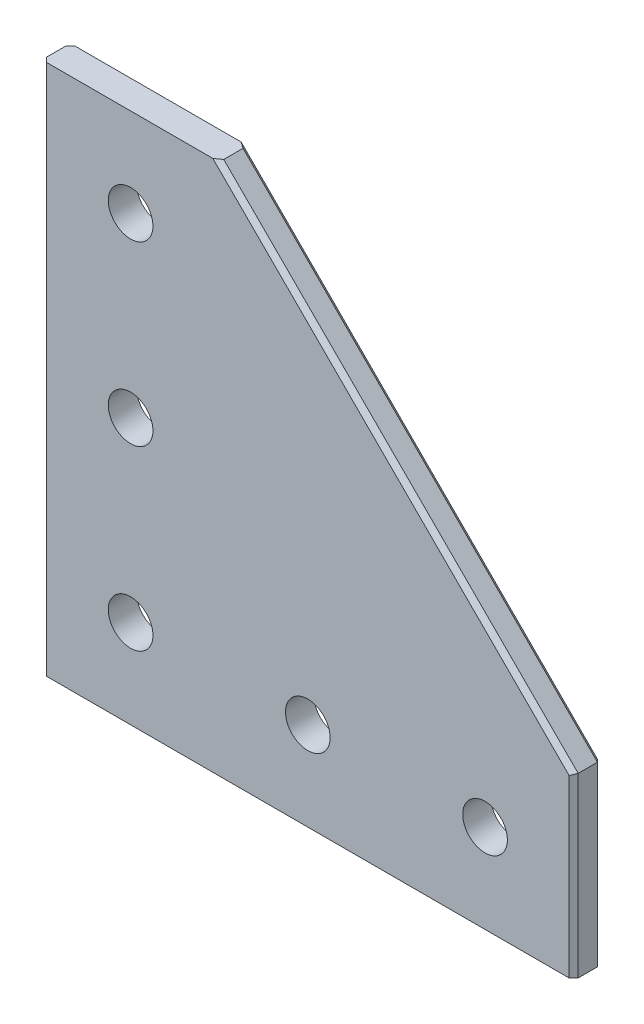
ISO-10303-21;
HEADER;
FILE_DESCRIPTION(('STEP AP214'),'2;1');
FILE_NAME('part.step','',(''),(''),'','','');
FILE_SCHEMA(('AUTOMOTIVE_DESIGN { 1 0 10303 214 1 1 1 1 }'));
ENDSEC;
DATA;
#1=APPLICATION_CONTEXT('core data for automotive mechanical design processes');
#2=APPLICATION_PROTOCOL_DEFINITION('international standard','automotive_design',2000,#1);
#3=PRODUCT_CONTEXT('',#1,'mechanical');
#4=PRODUCT('Part','Part','',(#3));
#5=PRODUCT_RELATED_PRODUCT_CATEGORY('part','',(#4));
#6=PRODUCT_DEFINITION_FORMATION('','',#4);
#7=PRODUCT_DEFINITION_CONTEXT('part definition',#1,'design');
#8=PRODUCT_DEFINITION('design','',#6,#7);
#9=PRODUCT_DEFINITION_SHAPE('','',#8);
#10=(LENGTH_UNIT() NAMED_UNIT(*) SI_UNIT(.MILLI.,.METRE.));
#11=(NAMED_UNIT(*) PLANE_ANGLE_UNIT() SI_UNIT($,.RADIAN.));
#12=(NAMED_UNIT(*) SI_UNIT($,.STERADIAN.) SOLID_ANGLE_UNIT());
#13=UNCERTAINTY_MEASURE_WITH_UNIT(LENGTH_MEASURE(1.E-05),#10,'distance_accuracy_value','');
#14=(GEOMETRIC_REPRESENTATION_CONTEXT(3) GLOBAL_UNCERTAINTY_ASSIGNED_CONTEXT((#13)) GLOBAL_UNIT_ASSIGNED_CONTEXT((#10,
#11,#12)) REPRESENTATION_CONTEXT('',''));
#15=CARTESIAN_POINT('',(0.,0.,0.));
#16=DIRECTION('',(0.,0.,1.));
#17=DIRECTION('',(1.,0.,0.));
#18=AXIS2_PLACEMENT_3D('',#15,#16,#17);
#19=CARTESIAN_POINT('',(51.0543413516609,33.397892325315,4.));
#20=DIRECTION('',(0.,0.,-1.));
#21=DIRECTION('',(-1.,0.,0.));
#22=AXIS2_PLACEMENT_3D('',#19,#20,#21);
#23=PLANE('',#22);
#24=CARTESIAN_POINT('',(13.5543413516609,-29.102107674685,4.));
#25=DIRECTION('',(0.,0.,1.));
#26=DIRECTION('',(1.,0.,0.));
#27=AXIS2_PLACEMENT_3D('',#24,#25,#26);
#28=CIRCLE('',#27,3.15);
#29=CARTESIAN_POINT('',(16.7043413516609,-29.102107674685,4.));
#30=VERTEX_POINT('',#29);
#31=EDGE_CURVE('E189',#30,#30,#28,.T.);
#32=ORIENTED_EDGE('',*,*,#31,.F.);
#33=EDGE_LOOP('',(#32));
#34=FACE_BOUND('',#33,.T.);
#35=CARTESIAN_POINT('',(-11.4456586483391,-4.102107674685,4.));
#36=DIRECTION('',(0.,0.,1.));
#37=DIRECTION('',(1.,0.,0.));
#38=AXIS2_PLACEMENT_3D('',#35,#36,#37);
#39=CIRCLE('',#38,3.15);
#40=CARTESIAN_POINT('',(-8.29565864833906,-4.102107674685,4.));
#41=VERTEX_POINT('',#40);
#42=EDGE_CURVE('E201',#41,#41,#39,.T.);
#43=ORIENTED_EDGE('',*,*,#42,.F.);
#44=EDGE_LOOP('',(#43));
#45=FACE_BOUND('',#44,.T.);
#46=DIRECTION('',(0.,1.,0.));
#47=VECTOR('',#46,1.);
#48=CARTESIAN_POINT('',(50.414341351661,33.397892325315,4.));
#49=LINE('',#48,#47);
#50=CARTESIAN_POINT('',(50.4143413516609,-41.602107674685,4.00000000000001));
#51=VERTEX_POINT('',#50);
#52=CARTESIAN_POINT('',(50.414341351661,-16.8672043546038,4.));
#53=VERTEX_POINT('',#52);
#54=EDGE_CURVE('E50',#51,#53,#49,.T.);
#55=ORIENTED_EDGE('',*,*,#54,.T.);
#56=DIRECTION('',(-0.707106781186548,0.707106781186547,0.));
#57=VECTOR('',#56,1.);
#58=CARTESIAN_POINT('',(25.6017930117016,7.9453439853556,4.));
#59=LINE('',#58,#57);
#60=CARTESIAN_POINT('',(0.149244671742174,33.397892325315,4.));
#61=VERTEX_POINT('',#60);
#62=EDGE_CURVE('E172',#53,#61,#59,.T.);
#63=ORIENTED_EDGE('',*,*,#62,.T.);
#64=DIRECTION('',(-1.,0.,0.));
#65=VECTOR('',#64,1.);
#66=CARTESIAN_POINT('',(1.05434135166094,33.397892325315,4.));
#67=LINE('',#66,#65);
#68=CARTESIAN_POINT('',(-23.305658648339,33.397892325315,4.));
#69=VERTEX_POINT('',#68);
#70=EDGE_CURVE('E119',#61,#69,#67,.T.);
#71=ORIENTED_EDGE('',*,*,#70,.T.);
#72=DIRECTION('',(0.,-1.,0.));
#73=VECTOR('',#72,1.);
#74=CARTESIAN_POINT('',(-23.3056586483391,33.397892325315,4.));
#75=LINE('',#74,#73);
#76=CARTESIAN_POINT('',(-23.3056586483391,-41.602107674685,4.));
#77=VERTEX_POINT('',#76);
#78=EDGE_CURVE('E168',#69,#77,#75,.T.);
#79=ORIENTED_EDGE('',*,*,#78,.T.);
#80=DIRECTION('',(1.,0.,0.));
#81=VECTOR('',#80,1.);
#82=CARTESIAN_POINT('',(-23.9456586483391,-41.602107674685,4.));
#83=LINE('',#82,#81);
#84=EDGE_CURVE('E135',#77,#51,#83,.T.);
#85=ORIENTED_EDGE('',*,*,#84,.T.);
#86=EDGE_LOOP('',(#55,#63,#71,#79,#85));
#87=FACE_BOUND('',#86,.T.);
#88=CARTESIAN_POINT('',(-11.4456586483391,-29.102107674685,4.));
#89=DIRECTION('',(0.,0.,1.));
#90=DIRECTION('',(1.,0.,0.));
#91=AXIS2_PLACEMENT_3D('',#88,#89,#90);
#92=CIRCLE('',#91,3.15);
#93=CARTESIAN_POINT('',(-8.29565864833906,-29.102107674685,4.));
#94=VERTEX_POINT('',#93);
#95=EDGE_CURVE('E207',#94,#94,#92,.T.);
#96=ORIENTED_EDGE('',*,*,#95,.F.);
#97=EDGE_LOOP('',(#96));
#98=FACE_BOUND('',#97,.T.);
#99=CARTESIAN_POINT('',(-11.4456586483391,20.897892325315,4.));
#100=DIRECTION('',(0.,0.,1.));
#101=DIRECTION('',(1.,0.,0.));
#102=AXIS2_PLACEMENT_3D('',#99,#100,#101);
#103=CIRCLE('',#102,3.15);
#104=CARTESIAN_POINT('',(-8.29565864833906,20.897892325315,4.));
#105=VERTEX_POINT('',#104);
#106=EDGE_CURVE('E195',#105,#105,#103,.T.);
#107=ORIENTED_EDGE('',*,*,#106,.F.);
#108=EDGE_LOOP('',(#107));
#109=FACE_BOUND('',#108,.T.);
#110=CARTESIAN_POINT('',(38.554341351661,-29.102107674685,4.));
#111=DIRECTION('',(0.,0.,1.));
#112=DIRECTION('',(1.,0.,0.));
#113=AXIS2_PLACEMENT_3D('',#110,#111,#112);
#114=CIRCLE('',#113,3.15);
#115=CARTESIAN_POINT('',(41.704341351661,-29.102107674685,4.));
#116=VERTEX_POINT('',#115);
#117=EDGE_CURVE('E181',#116,#116,#114,.T.);
#118=ORIENTED_EDGE('',*,*,#117,.F.);
#119=EDGE_LOOP('',(#118));
#120=FACE_BOUND('',#119,.T.);
#121=ADVANCED_FACE('F33',(#34,#45,#87,#98,#109,#120),#23,.F.);
#122=CARTESIAN_POINT('',(51.0543413516609,33.397892325315,0.));
#123=DIRECTION('',(0.,0.,-1.));
#124=DIRECTION('',(-1.,0.,0.));
#125=AXIS2_PLACEMENT_3D('',#122,#123,#124);
#126=PLANE('',#125);
#127=CARTESIAN_POINT('',(13.5543413516609,-29.102107674685,0.));
#128=DIRECTION('',(0.,0.,1.));
#129=DIRECTION('',(1.,0.,0.));
#130=AXIS2_PLACEMENT_3D('',#127,#128,#129);
#131=CIRCLE('',#130,3.15);
#132=CARTESIAN_POINT('',(16.7043413516609,-29.102107674685,0.));
#133=VERTEX_POINT('',#132);
#134=EDGE_CURVE('E186',#133,#133,#131,.T.);
#135=ORIENTED_EDGE('',*,*,#134,.T.);
#136=EDGE_LOOP('',(#135));
#137=FACE_BOUND('',#136,.T.);
#138=CARTESIAN_POINT('',(-11.4456586483391,-4.102107674685,0.));
#139=DIRECTION('',(0.,0.,1.));
#140=DIRECTION('',(1.,0.,0.));
#141=AXIS2_PLACEMENT_3D('',#138,#139,#140);
#142=CIRCLE('',#141,3.15);
#143=CARTESIAN_POINT('',(-8.29565864833906,-4.102107674685,0.));
#144=VERTEX_POINT('',#143);
#145=EDGE_CURVE('E198',#144,#144,#142,.T.);
#146=ORIENTED_EDGE('',*,*,#145,.T.);
#147=EDGE_LOOP('',(#146));
#148=FACE_BOUND('',#147,.T.);
#149=DIRECTION('',(-1.,0.,0.));
#150=VECTOR('',#149,1.);
#151=CARTESIAN_POINT('',(1.05434135166094,33.397892325315,0.));
#152=LINE('',#151,#150);
#153=CARTESIAN_POINT('',(0.149244671742153,33.397892325315,0.));
#154=VERTEX_POINT('',#153);
#155=CARTESIAN_POINT('',(-23.305658648339,33.397892325315,0.));
#156=VERTEX_POINT('',#155);
#157=EDGE_CURVE('E210',#154,#156,#152,.T.);
#158=ORIENTED_EDGE('',*,*,#157,.F.);
#159=DIRECTION('',(0.707106781186548,-0.707106781186547,0.));
#160=VECTOR('',#159,1.);
#161=CARTESIAN_POINT('',(50.6017930117015,-17.0546560146444,0.));
#162=LINE('',#161,#160);
#163=CARTESIAN_POINT('',(50.4143413516609,-16.8672043546038,0.));
#164=VERTEX_POINT('',#163);
#165=EDGE_CURVE('E155',#154,#164,#162,.T.);
#166=ORIENTED_EDGE('',*,*,#165,.T.);
#167=DIRECTION('',(0.,-1.,0.));
#168=VECTOR('',#167,1.);
#169=CARTESIAN_POINT('',(50.4143413516609,-41.602107674685,0.));
#170=LINE('',#169,#168);
#171=CARTESIAN_POINT('',(50.4143413516609,-41.602107674685,0.));
#172=VERTEX_POINT('',#171);
#173=EDGE_CURVE('E153',#164,#172,#170,.T.);
#174=ORIENTED_EDGE('',*,*,#173,.T.);
#175=DIRECTION('',(1.,0.,0.));
#176=VECTOR('',#175,1.);
#177=CARTESIAN_POINT('',(-23.9456586483391,-41.602107674685,0.));
#178=LINE('',#177,#176);
#179=CARTESIAN_POINT('',(-23.3056586483391,-41.602107674685,0.));
#180=VERTEX_POINT('',#179);
#181=EDGE_CURVE('E214',#180,#172,#178,.T.);
#182=ORIENTED_EDGE('',*,*,#181,.F.);
#183=DIRECTION('',(0.,1.,0.));
#184=VECTOR('',#183,1.);
#185=CARTESIAN_POINT('',(-23.3056586483391,33.397892325315,0.));
#186=LINE('',#185,#184);
#187=EDGE_CURVE('E151',#180,#156,#186,.T.);
#188=ORIENTED_EDGE('',*,*,#187,.T.);
#189=EDGE_LOOP('',(#158,#166,#174,#182,#188));
#190=FACE_BOUND('',#189,.T.);
#191=CARTESIAN_POINT('',(-11.4456586483391,-29.102107674685,0.));
#192=DIRECTION('',(0.,0.,1.));
#193=DIRECTION('',(1.,0.,0.));
#194=AXIS2_PLACEMENT_3D('',#191,#192,#193);
#195=CIRCLE('',#194,3.15);
#196=CARTESIAN_POINT('',(-8.29565864833906,-29.102107674685,0.));
#197=VERTEX_POINT('',#196);
#198=EDGE_CURVE('E204',#197,#197,#195,.T.);
#199=ORIENTED_EDGE('',*,*,#198,.T.);
#200=EDGE_LOOP('',(#199));
#201=FACE_BOUND('',#200,.T.);
#202=CARTESIAN_POINT('',(-11.4456586483391,20.897892325315,0.));
#203=DIRECTION('',(0.,0.,1.));
#204=DIRECTION('',(1.,0.,0.));
#205=AXIS2_PLACEMENT_3D('',#202,#203,#204);
#206=CIRCLE('',#205,3.15);
#207=CARTESIAN_POINT('',(-8.29565864833906,20.897892325315,0.));
#208=VERTEX_POINT('',#207);
#209=EDGE_CURVE('E192',#208,#208,#206,.T.);
#210=ORIENTED_EDGE('',*,*,#209,.T.);
#211=EDGE_LOOP('',(#210));
#212=FACE_BOUND('',#211,.T.);
#213=CARTESIAN_POINT('',(38.554341351661,-29.102107674685,0.));
#214=DIRECTION('',(0.,0.,1.));
#215=DIRECTION('',(1.,0.,0.));
#216=AXIS2_PLACEMENT_3D('',#213,#214,#215);
#217=CIRCLE('',#216,3.15);
#218=CARTESIAN_POINT('',(41.704341351661,-29.102107674685,0.));
#219=VERTEX_POINT('',#218);
#220=EDGE_CURVE('E176',#219,#219,#217,.T.);
#221=ORIENTED_EDGE('',*,*,#220,.T.);
#222=EDGE_LOOP('',(#221));
#223=FACE_BOUND('',#222,.T.);
#224=ADVANCED_FACE('F253',(#137,#148,#190,#201,#212,#223),#126,.T.);
#225=CARTESIAN_POINT('',(1.05434135166094,33.397892325315,4.));
#226=DIRECTION('',(0.,-1.,0.));
#227=DIRECTION('',(1.,0.,0.));
#228=AXIS2_PLACEMENT_3D('',#225,#226,#227);
#229=PLANE('',#228);
#230=DIRECTION('',(0.,0.,-1.));
#231=VECTOR('',#230,1.);
#232=CARTESIAN_POINT('',(1.05434135166094,33.397892325315,4.));
#233=LINE('',#232,#231);
#234=CARTESIAN_POINT('',(1.05434135166094,33.397892325315,3.36000000000001));
#235=VERTEX_POINT('',#234);
#236=CARTESIAN_POINT('',(1.05434135166094,33.397892325315,0.640000000000002));
#237=VERTEX_POINT('',#236);
#238=EDGE_CURVE('E117',#235,#237,#233,.T.);
#239=ORIENTED_EDGE('',*,*,#238,.T.);
#240=DIRECTION('',(-0.816496580927726,0.,-0.577350269189626));
#241=VECTOR('',#240,1.);
#242=CARTESIAN_POINT('',(34.3876746849943,33.397892325315,24.2102260395516));
#243=LINE('',#242,#241);
#244=EDGE_CURVE('E123',#237,#154,#243,.T.);
#245=ORIENTED_EDGE('',*,*,#244,.T.);
#246=ORIENTED_EDGE('',*,*,#157,.T.);
#247=DIRECTION('',(-0.707106781186548,0.,0.707106781186548));
#248=VECTOR('',#247,1.);
#249=CARTESIAN_POINT('',(-23.9456586483391,33.397892325315,0.640000000000002));
#250=LINE('',#249,#248);
#251=CARTESIAN_POINT('',(-23.9456586483391,33.397892325315,0.640000000000003));
#252=VERTEX_POINT('',#251);
#253=EDGE_CURVE('E124',#156,#252,#250,.T.);
#254=ORIENTED_EDGE('',*,*,#253,.T.);
#255=DIRECTION('',(0.,0.,-1.));
#256=VECTOR('',#255,1.);
#257=CARTESIAN_POINT('',(-23.9456586483391,33.397892325315,4.));
#258=LINE('',#257,#256);
#259=CARTESIAN_POINT('',(-23.9456586483391,33.397892325315,3.36));
#260=VERTEX_POINT('',#259);
#261=EDGE_CURVE('E139',#260,#252,#258,.T.);
#262=ORIENTED_EDGE('',*,*,#261,.F.);
#263=DIRECTION('',(-0.707106781186548,0.,-0.707106781186548));
#264=VECTOR('',#263,1.);
#265=CARTESIAN_POINT('',(-23.3056586483391,33.397892325315,4.));
#266=LINE('',#265,#264);
#267=EDGE_CURVE('E141',#260,#69,#266,.F.);
#268=ORIENTED_EDGE('',*,*,#267,.T.);
#269=ORIENTED_EDGE('',*,*,#70,.F.);
#270=DIRECTION('',(-0.816496580927728,0.,0.577350269189624));
#271=VECTOR('',#270,1.);
#272=CARTESIAN_POINT('',(17.1176102317152,33.397892325315,-7.99844635310911));
#273=LINE('',#272,#271);
#274=EDGE_CURVE('E114',#61,#235,#273,.F.);
#275=ORIENTED_EDGE('',*,*,#274,.T.);
#276=EDGE_LOOP('',(#239,#245,#246,#254,#262,#268,#269,#275));
#277=FACE_BOUND('',#276,.T.);
#278=ADVANCED_FACE('F116',(#277),#229,.F.);
#279=CARTESIAN_POINT('',(-23.9456586483391,33.397892325315,4.));
#280=DIRECTION('',(1.,0.,0.));
#281=DIRECTION('',(0.,1.,0.));
#282=AXIS2_PLACEMENT_3D('',#279,#280,#281);
#283=PLANE('',#282);
#284=ORIENTED_EDGE('',*,*,#261,.T.);
#285=DIRECTION('',(0.,-1.,0.));
#286=VECTOR('',#285,1.);
#287=CARTESIAN_POINT('',(-23.9456586483391,-41.602107674685,0.640000000000002));
#288=LINE('',#287,#286);
#289=CARTESIAN_POINT('',(-23.9456586483391,-41.602107674685,0.640000000000001));
#290=VERTEX_POINT('',#289);
#291=EDGE_CURVE('E11',#252,#290,#288,.T.);
#292=ORIENTED_EDGE('',*,*,#291,.T.);
#293=DIRECTION('',(0.,0.,-1.));
#294=VECTOR('',#293,1.);
#295=CARTESIAN_POINT('',(-23.9456586483391,-41.602107674685,4.));
#296=LINE('',#295,#294);
#297=CARTESIAN_POINT('',(-23.9456586483391,-41.602107674685,3.36));
#298=VERTEX_POINT('',#297);
#299=EDGE_CURVE('E144',#298,#290,#296,.T.);
#300=ORIENTED_EDGE('',*,*,#299,.F.);
#301=DIRECTION('',(0.,1.,0.));
#302=VECTOR('',#301,1.);
#303=CARTESIAN_POINT('',(-23.9456586483391,33.397892325315,3.36));
#304=LINE('',#303,#302);
#305=EDGE_CURVE('E42',#298,#260,#304,.T.);
#306=ORIENTED_EDGE('',*,*,#305,.T.);
#307=EDGE_LOOP('',(#284,#292,#300,#306));
#308=FACE_BOUND('',#307,.T.);
#309=ADVANCED_FACE('F231',(#308),#283,.F.);
#310=CARTESIAN_POINT('',(-23.9456586483391,-41.602107674685,4.));
#311=DIRECTION('',(0.,1.,0.));
#312=DIRECTION('',(0.,0.,1.));
#313=AXIS2_PLACEMENT_3D('',#310,#311,#312);
#314=PLANE('',#313);
#315=ORIENTED_EDGE('',*,*,#181,.T.);
#316=DIRECTION('',(0.707106781186548,0.,0.707106781186548));
#317=VECTOR('',#316,1.);
#318=CARTESIAN_POINT('',(51.0543413516609,-41.602107674685,0.640000000000002));
#319=LINE('',#318,#317);
#320=CARTESIAN_POINT('',(51.0543413516609,-41.602107674685,0.640000000000003));
#321=VERTEX_POINT('',#320);
#322=EDGE_CURVE('E166',#172,#321,#319,.T.);
#323=ORIENTED_EDGE('',*,*,#322,.T.);
#324=DIRECTION('',(0.,0.,-1.));
#325=VECTOR('',#324,1.);
#326=CARTESIAN_POINT('',(51.0543413516609,-41.602107674685,4.));
#327=LINE('',#326,#325);
#328=CARTESIAN_POINT('',(51.0543413516609,-41.602107674685,3.36000000000001));
#329=VERTEX_POINT('',#328);
#330=EDGE_CURVE('E221',#329,#321,#327,.T.);
#331=ORIENTED_EDGE('',*,*,#330,.F.);
#332=DIRECTION('',(0.707106781186548,0.,-0.707106781186548));
#333=VECTOR('',#332,1.);
#334=CARTESIAN_POINT('',(50.414341351661,-41.602107674685,4.));
#335=LINE('',#334,#333);
#336=EDGE_CURVE('E164',#329,#51,#335,.F.);
#337=ORIENTED_EDGE('',*,*,#336,.T.);
#338=ORIENTED_EDGE('',*,*,#84,.F.);
#339=DIRECTION('',(0.707106781186548,0.,0.707106781186548));
#340=VECTOR('',#339,1.);
#341=CARTESIAN_POINT('',(-23.3056586483391,-41.602107674685,4.));
#342=LINE('',#341,#340);
#343=EDGE_CURVE('E161',#77,#298,#342,.F.);
#344=ORIENTED_EDGE('',*,*,#343,.T.);
#345=ORIENTED_EDGE('',*,*,#299,.T.);
#346=DIRECTION('',(0.707106781186548,0.,-0.707106781186548));
#347=VECTOR('',#346,1.);
#348=CARTESIAN_POINT('',(-23.9456586483391,-41.602107674685,0.640000000000003));
#349=LINE('',#348,#347);
#350=EDGE_CURVE('E58',#290,#180,#349,.T.);
#351=ORIENTED_EDGE('',*,*,#350,.T.);
#352=EDGE_LOOP('',(#315,#323,#331,#337,#338,#344,#345,#351));
#353=FACE_BOUND('',#352,.T.);
#354=ADVANCED_FACE('F226',(#353),#314,.F.);
#355=CARTESIAN_POINT('',(51.0543413516609,-41.602107674685,4.));
#356=DIRECTION('',(-1.,0.,0.));
#357=DIRECTION('',(0.,0.,1.));
#358=AXIS2_PLACEMENT_3D('',#355,#356,#357);
#359=PLANE('',#358);
#360=ORIENTED_EDGE('',*,*,#330,.T.);
#361=DIRECTION('',(0.,1.,0.));
#362=VECTOR('',#361,1.);
#363=CARTESIAN_POINT('',(51.0543413516609,-16.602107674685,0.640000000000002));
#364=LINE('',#363,#362);
#365=CARTESIAN_POINT('',(51.0543413516609,-16.602107674685,0.640000000000002));
#366=VERTEX_POINT('',#365);
#367=EDGE_CURVE('E159',#321,#366,#364,.T.);
#368=ORIENTED_EDGE('',*,*,#367,.T.);
#369=DIRECTION('',(0.,0.,-1.));
#370=VECTOR('',#369,1.);
#371=CARTESIAN_POINT('',(51.0543413516609,-16.602107674685,4.));
#372=LINE('',#371,#370);
#373=CARTESIAN_POINT('',(51.0543413516609,-16.602107674685,3.36000000000001));
#374=VERTEX_POINT('',#373);
#375=EDGE_CURVE('E134',#374,#366,#372,.T.);
#376=ORIENTED_EDGE('',*,*,#375,.F.);
#377=DIRECTION('',(0.,-1.,0.));
#378=VECTOR('',#377,1.);
#379=CARTESIAN_POINT('',(51.0543413516609,-41.602107674685,3.36000000000001));
#380=LINE('',#379,#378);
#381=EDGE_CURVE('E157',#374,#329,#380,.T.);
#382=ORIENTED_EDGE('',*,*,#381,.T.);
#383=EDGE_LOOP('',(#360,#368,#376,#382));
#384=FACE_BOUND('',#383,.T.);
#385=ADVANCED_FACE('F243',(#384),#359,.F.);
#386=CARTESIAN_POINT('',(51.0543413516609,-16.602107674685,4.));
#387=DIRECTION('',(-0.707106781186547,-0.707106781186548,0.));
#388=DIRECTION('',(0.707106781186548,-0.707106781186547,0.));
#389=AXIS2_PLACEMENT_3D('',#386,#387,#388);
#390=PLANE('',#389);
#391=ORIENTED_EDGE('',*,*,#375,.T.);
#392=DIRECTION('',(-0.707106781186548,0.707106781186547,0.));
#393=VECTOR('',#392,1.);
#394=CARTESIAN_POINT('',(1.05434135166094,33.397892325315,0.640000000000002));
#395=LINE('',#394,#393);
#396=EDGE_CURVE('E133',#366,#237,#395,.T.);
#397=ORIENTED_EDGE('',*,*,#396,.T.);
#398=ORIENTED_EDGE('',*,*,#238,.F.);
#399=DIRECTION('',(0.707106781186548,-0.707106781186547,0.));
#400=VECTOR('',#399,1.);
#401=CARTESIAN_POINT('',(51.0543413516609,-16.602107674685,3.36000000000001));
#402=LINE('',#401,#400);
#403=EDGE_CURVE('E130',#235,#374,#402,.T.);
#404=ORIENTED_EDGE('',*,*,#403,.T.);
#405=EDGE_LOOP('',(#391,#397,#398,#404));
#406=FACE_BOUND('',#405,.T.);
#407=ADVANCED_FACE('F129',(#406),#390,.F.);
#408=CARTESIAN_POINT('',(-11.4456586483391,-29.102107674685,4.));
#409=DIRECTION('',(0.,0.,-1.));
#410=DIRECTION('',(-1.,0.,0.));
#411=AXIS2_PLACEMENT_3D('',#408,#409,#410);
#412=CYLINDRICAL_SURFACE('',#411,3.15);
#413=ORIENTED_EDGE('',*,*,#95,.T.);
#414=EDGE_LOOP('',(#413));
#415=FACE_BOUND('',#414,.T.);
#416=ORIENTED_EDGE('',*,*,#198,.F.);
#417=EDGE_LOOP('',(#416));
#418=FACE_BOUND('',#417,.T.);
#419=ADVANCED_FACE('F274',(#415,#418),#412,.F.);
#420=CARTESIAN_POINT('',(-11.4456586483391,-4.102107674685,4.));
#421=DIRECTION('',(0.,0.,-1.));
#422=DIRECTION('',(-1.,0.,0.));
#423=AXIS2_PLACEMENT_3D('',#420,#421,#422);
#424=CYLINDRICAL_SURFACE('',#423,3.15);
#425=ORIENTED_EDGE('',*,*,#42,.T.);
#426=EDGE_LOOP('',(#425));
#427=FACE_BOUND('',#426,.T.);
#428=ORIENTED_EDGE('',*,*,#145,.F.);
#429=EDGE_LOOP('',(#428));
#430=FACE_BOUND('',#429,.T.);
#431=ADVANCED_FACE('F350',(#427,#430),#424,.F.);
#432=CARTESIAN_POINT('',(-11.4456586483391,20.897892325315,4.));
#433=DIRECTION('',(0.,0.,-1.));
#434=DIRECTION('',(-1.,0.,0.));
#435=AXIS2_PLACEMENT_3D('',#432,#433,#434);
#436=CYLINDRICAL_SURFACE('',#435,3.15);
#437=ORIENTED_EDGE('',*,*,#106,.T.);
#438=EDGE_LOOP('',(#437));
#439=FACE_BOUND('',#438,.T.);
#440=ORIENTED_EDGE('',*,*,#209,.F.);
#441=EDGE_LOOP('',(#440));
#442=FACE_BOUND('',#441,.T.);
#443=ADVANCED_FACE('F341',(#439,#442),#436,.F.);
#444=CARTESIAN_POINT('',(13.5543413516609,-29.102107674685,4.));
#445=DIRECTION('',(0.,0.,-1.));
#446=DIRECTION('',(-1.,0.,0.));
#447=AXIS2_PLACEMENT_3D('',#444,#445,#446);
#448=CYLINDRICAL_SURFACE('',#447,3.15);
#449=ORIENTED_EDGE('',*,*,#31,.T.);
#450=EDGE_LOOP('',(#449));
#451=FACE_BOUND('',#450,.T.);
#452=ORIENTED_EDGE('',*,*,#134,.F.);
#453=EDGE_LOOP('',(#452));
#454=FACE_BOUND('',#453,.T.);
#455=ADVANCED_FACE('F332',(#451,#454),#448,.F.);
#456=CARTESIAN_POINT('',(38.554341351661,-29.102107674685,4.));
#457=DIRECTION('',(0.,0.,-1.));
#458=DIRECTION('',(-1.,0.,0.));
#459=AXIS2_PLACEMENT_3D('',#456,#457,#458);
#460=CYLINDRICAL_SURFACE('',#459,3.15);
#461=ORIENTED_EDGE('',*,*,#117,.T.);
#462=EDGE_LOOP('',(#461));
#463=FACE_BOUND('',#462,.T.);
#464=ORIENTED_EDGE('',*,*,#220,.F.);
#465=EDGE_LOOP('',(#464));
#466=FACE_BOUND('',#465,.T.);
#467=ADVANCED_FACE('F290',(#463,#466),#460,.F.);
#468=CARTESIAN_POINT('',(51.0543413516609,-41.602107674685,0.640000000000002));
#469=DIRECTION('',(0.707106781186548,0.,-0.707106781186548));
#470=DIRECTION('',(-0.707106781186548,0.,-0.707106781186548));
#471=AXIS2_PLACEMENT_3D('',#468,#469,#470);
#472=PLANE('',#471);
#473=ORIENTED_EDGE('',*,*,#322,.F.);
#474=ORIENTED_EDGE('',*,*,#173,.F.);
#475=DIRECTION('',(0.678598344545847,0.28108463771482,0.678598344545847));
#476=VECTOR('',#475,1.);
#477=CARTESIAN_POINT('',(46.2857521058973,-18.5773220136668,-4.12858924576365));
#478=LINE('',#477,#476);
#479=EDGE_CURVE('E174',#366,#164,#478,.F.);
#480=ORIENTED_EDGE('',*,*,#479,.F.);
#481=ORIENTED_EDGE('',*,*,#367,.F.);
#482=EDGE_LOOP('',(#473,#474,#480,#481));
#483=FACE_BOUND('',#482,.T.);
#484=ADVANCED_FACE('F248',(#483),#472,.T.);
#485=CARTESIAN_POINT('',(51.0543413516609,-16.602107674685,0.640000000000002));
#486=DIRECTION('',(0.5,0.5,-0.707106781186547));
#487=DIRECTION('',(0.,0.816496580927726,0.577350269189626));
#488=AXIS2_PLACEMENT_3D('',#485,#486,#487);
#489=PLANE('',#488);
#490=ORIENTED_EDGE('',*,*,#479,.T.);
#491=ORIENTED_EDGE('',*,*,#165,.F.);
#492=ORIENTED_EDGE('',*,*,#244,.F.);
#493=ORIENTED_EDGE('',*,*,#396,.F.);
#494=EDGE_LOOP('',(#490,#491,#492,#493));
#495=FACE_BOUND('',#494,.T.);
#496=ADVANCED_FACE('F249',(#495),#489,.T.);
#497=CARTESIAN_POINT('',(50.414341351661,33.397892325315,4.));
#498=DIRECTION('',(-0.707106781186547,0.,-0.707106781186547));
#499=DIRECTION('',(-0.707106781186548,0.,0.707106781186548));
#500=AXIS2_PLACEMENT_3D('',#497,#498,#499);
#501=PLANE('',#500);
#502=ORIENTED_EDGE('',*,*,#336,.F.);
#503=ORIENTED_EDGE('',*,*,#381,.F.);
#504=DIRECTION('',(-0.678598344545846,-0.281084637714825,0.678598344545846));
#505=VECTOR('',#504,1.);
#506=CARTESIAN_POINT('',(60.0020853302663,-12.8958307661044,-5.58774397860539));
#507=LINE('',#506,#505);
#508=EDGE_CURVE('E37',#53,#374,#507,.F.);
#509=ORIENTED_EDGE('',*,*,#508,.F.);
#510=ORIENTED_EDGE('',*,*,#54,.F.);
#511=EDGE_LOOP('',(#502,#503,#509,#510));
#512=FACE_BOUND('',#511,.T.);
#513=ADVANCED_FACE('F241',(#512),#501,.F.);
#514=CARTESIAN_POINT('',(25.6017930117016,7.9453439853556,4.));
#515=DIRECTION('',(-0.499999999999999,-0.499999999999999,-0.707106781186549));
#516=DIRECTION('',(0.,0.816496580927727,-0.577350269189624));
#517=AXIS2_PLACEMENT_3D('',#514,#515,#516);
#518=PLANE('',#517);
#519=ORIENTED_EDGE('',*,*,#508,.T.);
#520=ORIENTED_EDGE('',*,*,#403,.F.);
#521=ORIENTED_EDGE('',*,*,#274,.F.);
#522=ORIENTED_EDGE('',*,*,#62,.F.);
#523=EDGE_LOOP('',(#519,#520,#521,#522));
#524=FACE_BOUND('',#523,.T.);
#525=ADVANCED_FACE('F138',(#524),#518,.F.);
#526=CARTESIAN_POINT('',(-23.9456586483391,33.397892325315,0.640000000000002));
#527=DIRECTION('',(-0.707106781186548,0.,-0.707106781186548));
#528=DIRECTION('',(-0.707106781186548,0.,0.707106781186548));
#529=AXIS2_PLACEMENT_3D('',#526,#527,#528);
#530=PLANE('',#529);
#531=ORIENTED_EDGE('',*,*,#253,.F.);
#532=ORIENTED_EDGE('',*,*,#187,.F.);
#533=ORIENTED_EDGE('',*,*,#350,.F.);
#534=ORIENTED_EDGE('',*,*,#291,.F.);
#535=EDGE_LOOP('',(#531,#532,#533,#534));
#536=FACE_BOUND('',#535,.T.);
#537=ADVANCED_FACE('F255',(#536),#530,.T.);
#538=CARTESIAN_POINT('',(-23.3056586483391,33.397892325315,4.));
#539=DIRECTION('',(0.707106781186548,0.,-0.707106781186548));
#540=DIRECTION('',(-0.707106781186548,0.,-0.707106781186548));
#541=AXIS2_PLACEMENT_3D('',#538,#539,#540);
#542=PLANE('',#541);
#543=ORIENTED_EDGE('',*,*,#267,.F.);
#544=ORIENTED_EDGE('',*,*,#305,.F.);
#545=ORIENTED_EDGE('',*,*,#343,.F.);
#546=ORIENTED_EDGE('',*,*,#78,.F.);
#547=EDGE_LOOP('',(#543,#544,#545,#546));
#548=FACE_BOUND('',#547,.T.);
#549=ADVANCED_FACE('F35',(#548),#542,.F.);
#550=CLOSED_SHELL('',(#121,#224,#278,#309,#354,#385,#407,#419,#431,#443,#455,#467,#484,#496,
#513,#525,#537,#549));
#551=MANIFOLD_SOLID_BREP('B2',#550);
#552=ADVANCED_BREP_SHAPE_REPRESENTATION('',(#18,#551),#14);
#553=SHAPE_DEFINITION_REPRESENTATION(#9,#552);
ENDSEC;
END-ISO-10303-21;
